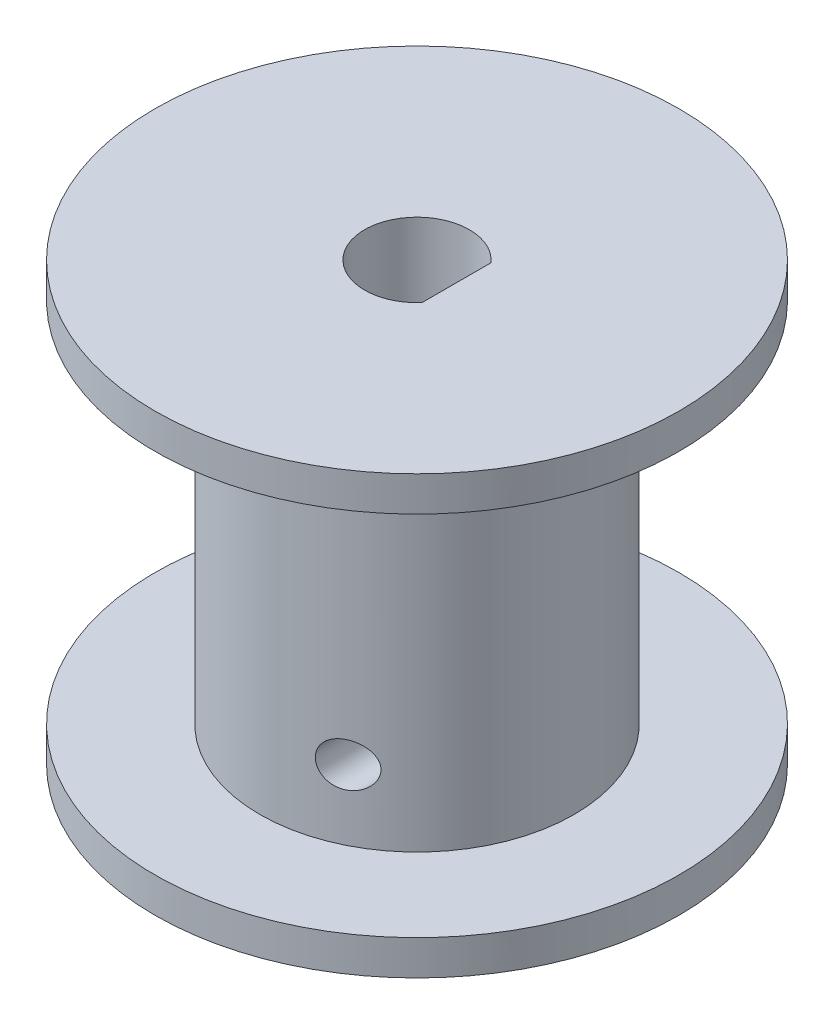
ISO-10303-21;
HEADER;
FILE_DESCRIPTION(('STEP AP214'),'2;1');
FILE_NAME('part.step','',(''),(''),'','','');
FILE_SCHEMA(('AUTOMOTIVE_DESIGN { 1 0 10303 214 1 1 1 1 }'));
ENDSEC;
DATA;
#1=APPLICATION_CONTEXT('core data for automotive mechanical design processes');
#2=APPLICATION_PROTOCOL_DEFINITION('international standard','automotive_design',2000,#1);
#3=PRODUCT_CONTEXT('',#1,'mechanical');
#4=PRODUCT('Part','Part','',(#3));
#5=PRODUCT_RELATED_PRODUCT_CATEGORY('part','',(#4));
#6=PRODUCT_DEFINITION_FORMATION('','',#4);
#7=PRODUCT_DEFINITION_CONTEXT('part definition',#1,'design');
#8=PRODUCT_DEFINITION('design','',#6,#7);
#9=PRODUCT_DEFINITION_SHAPE('','',#8);
#10=(LENGTH_UNIT() NAMED_UNIT(*) SI_UNIT(.MILLI.,.METRE.));
#11=(NAMED_UNIT(*) PLANE_ANGLE_UNIT() SI_UNIT($,.RADIAN.));
#12=(NAMED_UNIT(*) SI_UNIT($,.STERADIAN.) SOLID_ANGLE_UNIT());
#13=UNCERTAINTY_MEASURE_WITH_UNIT(LENGTH_MEASURE(1.E-05),#10,'distance_accuracy_value','');
#14=(GEOMETRIC_REPRESENTATION_CONTEXT(3) GLOBAL_UNCERTAINTY_ASSIGNED_CONTEXT((#13)) GLOBAL_UNIT_ASSIGNED_CONTEXT((#10,
#11,#12)) REPRESENTATION_CONTEXT('',''));
#15=CARTESIAN_POINT('',(0.,0.,0.));
#16=DIRECTION('',(0.,0.,1.));
#17=DIRECTION('',(1.,0.,0.));
#18=AXIS2_PLACEMENT_3D('',#15,#16,#17);
#19=CARTESIAN_POINT('',(0.,25.,0.));
#20=DIRECTION('',(0.,-1.,0.));
#21=DIRECTION('',(0.,0.,-1.));
#22=AXIS2_PLACEMENT_3D('',#19,#20,#21);
#23=CYLINDRICAL_SURFACE('',#22,15.);
#24=CARTESIAN_POINT('',(0.,23.,0.));
#25=DIRECTION('',(0.,-1.,0.));
#26=DIRECTION('',(0.,0.,-1.));
#27=AXIS2_PLACEMENT_3D('',#24,#25,#26);
#28=CIRCLE('',#27,15.);
#29=CARTESIAN_POINT('',(0.,23.,-15.));
#30=VERTEX_POINT('',#29);
#31=EDGE_CURVE('E90',#30,#30,#28,.T.);
#32=ORIENTED_EDGE('',*,*,#31,.F.);
#33=EDGE_LOOP('',(#32));
#34=FACE_BOUND('',#33,.T.);
#35=CARTESIAN_POINT('',(0.,25.,0.));
#36=DIRECTION('',(0.,1.,0.));
#37=DIRECTION('',(0.,0.,1.));
#38=AXIS2_PLACEMENT_3D('',#35,#36,#37);
#39=CIRCLE('',#38,15.);
#40=CARTESIAN_POINT('',(0.,25.,15.));
#41=VERTEX_POINT('',#40);
#42=EDGE_CURVE('E11',#41,#41,#39,.T.);
#43=ORIENTED_EDGE('',*,*,#42,.F.);
#44=EDGE_LOOP('',(#43));
#45=FACE_BOUND('',#44,.T.);
#46=ADVANCED_FACE('F33',(#34,#45),#23,.T.);
#47=CARTESIAN_POINT('',(0.,2.,0.));
#48=DIRECTION('',(0.,-1.,0.));
#49=DIRECTION('',(0.,0.,-1.));
#50=AXIS2_PLACEMENT_3D('',#47,#48,#49);
#51=CIRCLE('',#50,15.);
#52=CARTESIAN_POINT('',(0.,2.,-15.));
#53=VERTEX_POINT('',#52);
#54=EDGE_CURVE('E185',#53,#53,#51,.T.);
#55=ORIENTED_EDGE('',*,*,#54,.T.);
#56=EDGE_LOOP('',(#55));
#57=FACE_BOUND('',#56,.T.);
#58=CARTESIAN_POINT('',(0.,0.,0.));
#59=DIRECTION('',(0.,1.,0.));
#60=DIRECTION('',(0.,0.,1.));
#61=AXIS2_PLACEMENT_3D('',#58,#59,#60);
#62=CIRCLE('',#61,15.);
#63=CARTESIAN_POINT('',(0.,0.,15.));
#64=VERTEX_POINT('',#63);
#65=EDGE_CURVE('E46',#64,#64,#62,.T.);
#66=ORIENTED_EDGE('',*,*,#65,.T.);
#67=EDGE_LOOP('',(#66));
#68=FACE_BOUND('',#67,.T.);
#69=ADVANCED_FACE('F35',(#57,#68),#23,.T.);
#70=CARTESIAN_POINT('',(0.,0.,0.));
#71=DIRECTION('',(0.,1.,0.));
#72=DIRECTION('',(0.,0.,1.));
#73=AXIS2_PLACEMENT_3D('',#70,#71,#72);
#74=CYLINDRICAL_SURFACE('',#73,3.);
#75=DIRECTION('',(0.,-1.,0.));
#76=VECTOR('',#75,1.);
#77=CARTESIAN_POINT('',(2.26,25.,-1.97291662266807));
#78=LINE('',#77,#76);
#79=CARTESIAN_POINT('',(2.26,25.,-1.97291662266807));
#80=VERTEX_POINT('',#79);
#81=CARTESIAN_POINT('',(2.26,0.,-1.97291662266807));
#82=VERTEX_POINT('',#81);
#83=EDGE_CURVE('E54',#80,#82,#78,.T.);
#84=ORIENTED_EDGE('',*,*,#83,.F.);
#85=CARTESIAN_POINT('',(0.,25.,0.));
#86=DIRECTION('',(0.,1.,0.));
#87=DIRECTION('',(0.,0.,1.));
#88=AXIS2_PLACEMENT_3D('',#85,#86,#87);
#89=CIRCLE('',#88,3.);
#90=CARTESIAN_POINT('',(2.26,25.,1.97291662266807));
#91=VERTEX_POINT('',#90);
#92=EDGE_CURVE('E77',#80,#91,#89,.T.);
#93=ORIENTED_EDGE('',*,*,#92,.T.);
#94=DIRECTION('',(0.,-1.,0.));
#95=VECTOR('',#94,1.);
#96=CARTESIAN_POINT('',(2.26,25.,1.97291662266807));
#97=LINE('',#96,#95);
#98=CARTESIAN_POINT('',(2.26,0.,1.97291662266807));
#99=VERTEX_POINT('',#98);
#100=EDGE_CURVE('E68',#91,#99,#97,.T.);
#101=ORIENTED_EDGE('',*,*,#100,.T.);
#102=CARTESIAN_POINT('',(0.,0.,0.));
#103=DIRECTION('',(0.,1.,0.));
#104=DIRECTION('',(0.,0.,1.));
#105=AXIS2_PLACEMENT_3D('',#102,#103,#104);
#106=CIRCLE('',#105,3.);
#107=EDGE_CURVE('E76',#82,#99,#106,.T.);
#108=ORIENTED_EDGE('',*,*,#107,.F.);
#109=EDGE_LOOP('',(#84,#93,#101,#108));
#110=FACE_BOUND('',#109,.T.);
#111=ADVANCED_FACE('F75',(#110),#74,.F.);
#112=CARTESIAN_POINT('',(0.,25.,0.));
#113=DIRECTION('',(0.,1.,0.));
#114=DIRECTION('',(0.,0.,1.));
#115=AXIS2_PLACEMENT_3D('',#112,#113,#114);
#116=PLANE('',#115);
#117=DIRECTION('',(0.,0.,1.));
#118=VECTOR('',#117,1.);
#119=CARTESIAN_POINT('',(2.26,25.,-1.97291662266807));
#120=LINE('',#119,#118);
#121=EDGE_CURVE('E61',#80,#91,#120,.T.);
#122=ORIENTED_EDGE('',*,*,#121,.T.);
#123=ORIENTED_EDGE('',*,*,#92,.F.);
#124=EDGE_LOOP('',(#122,#123));
#125=FACE_BOUND('',#124,.T.);
#126=ORIENTED_EDGE('',*,*,#42,.T.);
#127=EDGE_LOOP('',(#126));
#128=FACE_BOUND('',#127,.T.);
#129=ADVANCED_FACE('F121',(#125,#128),#116,.T.);
#130=CARTESIAN_POINT('',(0.,0.,0.));
#131=DIRECTION('',(0.,1.,0.));
#132=DIRECTION('',(0.,0.,1.));
#133=AXIS2_PLACEMENT_3D('',#130,#131,#132);
#134=PLANE('',#133);
#135=ORIENTED_EDGE('',*,*,#107,.T.);
#136=DIRECTION('',(0.,0.,1.));
#137=VECTOR('',#136,1.);
#138=CARTESIAN_POINT('',(2.26,0.,-1.97291662266807));
#139=LINE('',#138,#137);
#140=EDGE_CURVE('E65',#82,#99,#139,.T.);
#141=ORIENTED_EDGE('',*,*,#140,.F.);
#142=EDGE_LOOP('',(#135,#141));
#143=FACE_BOUND('',#142,.T.);
#144=ORIENTED_EDGE('',*,*,#65,.F.);
#145=EDGE_LOOP('',(#144));
#146=FACE_BOUND('',#145,.T.);
#147=ADVANCED_FACE('F79',(#143,#146),#134,.F.);
#148=CARTESIAN_POINT('',(2.26,25.,-1.97291662266807));
#149=DIRECTION('',(1.,0.,0.));
#150=DIRECTION('',(0.,0.,-1.));
#151=AXIS2_PLACEMENT_3D('',#148,#149,#150);
#152=PLANE('',#151);
#153=ORIENTED_EDGE('',*,*,#140,.T.);
#154=ORIENTED_EDGE('',*,*,#100,.F.);
#155=ORIENTED_EDGE('',*,*,#121,.F.);
#156=ORIENTED_EDGE('',*,*,#83,.T.);
#157=EDGE_LOOP('',(#153,#154,#155,#156));
#158=FACE_BOUND('',#157,.T.);
#159=ADVANCED_FACE('F67',(#158),#152,.F.);
#160=CARTESIAN_POINT('',(15.,23.,0.));
#161=DIRECTION('',(0.,1.,0.));
#162=DIRECTION('',(0.,0.,1.));
#163=AXIS2_PLACEMENT_3D('',#160,#161,#162);
#164=PLANE('',#163);
#165=CARTESIAN_POINT('',(0.,23.,0.));
#166=DIRECTION('',(0.,-1.,0.));
#167=DIRECTION('',(0.,0.,-1.));
#168=AXIS2_PLACEMENT_3D('',#165,#166,#167);
#169=CIRCLE('',#168,9.);
#170=CARTESIAN_POINT('',(0.,23.,-9.));
#171=VERTEX_POINT('',#170);
#172=EDGE_CURVE('E182',#171,#171,#169,.T.);
#173=ORIENTED_EDGE('',*,*,#172,.F.);
#174=EDGE_LOOP('',(#173));
#175=FACE_BOUND('',#174,.T.);
#176=ORIENTED_EDGE('',*,*,#31,.T.);
#177=EDGE_LOOP('',(#176));
#178=FACE_BOUND('',#177,.T.);
#179=ADVANCED_FACE('F100',(#175,#178),#164,.F.);
#180=CARTESIAN_POINT('',(0.,0.,0.));
#181=DIRECTION('',(0.,-1.,0.));
#182=DIRECTION('',(0.,0.,-1.));
#183=AXIS2_PLACEMENT_3D('',#180,#181,#182);
#184=CYLINDRICAL_SURFACE('',#183,9.);
#185=CARTESIAN_POINT('',(2.75,6.,8.56956825050131));
#186=CARTESIAN_POINT('',(2.74999898445752,6.06748109284129,8.56956840033699));
#187=CARTESIAN_POINT('',(2.75548050125752,6.13495503922291,8.56781528844884));
#188=CARTESIAN_POINT('',(2.77720005153497,6.26795282341906,8.56079953902308));
#189=CARTESIAN_POINT('',(2.7934366566861,6.3334769189757,8.55553736750447));
#190=CARTESIAN_POINT('',(2.83605736016252,6.46069018226167,8.54150322785503));
#191=CARTESIAN_POINT('',(2.86243568202035,6.52238150984727,8.53273325756391));
#192=CARTESIAN_POINT('',(2.92438471916907,6.64030334146552,8.51170013441259));
#193=CARTESIAN_POINT('',(2.95995580116299,6.69653362753181,8.49943684220033));
#194=CARTESIAN_POINT('',(3.03957361788372,6.80283899041248,8.47129227907988));
#195=CARTESIAN_POINT('',(3.08372826766199,6.85282074785538,8.45536441069197));
#196=CARTESIAN_POINT('',(3.17867208005764,6.94460726158576,8.42013089724981));
#197=CARTESIAN_POINT('',(3.22946212169081,6.98641093265511,8.40082480455404));
#198=CARTESIAN_POINT('',(3.33837424271175,7.06271456478328,8.35815879003311));
#199=CARTESIAN_POINT('',(3.39671924444672,7.09681738768659,8.33465898835829));
#200=CARTESIAN_POINT('',(3.51702956185443,7.15486161851635,8.28460927007217));
#201=CARTESIAN_POINT('',(3.57899593388826,7.17880004446604,8.2580584612714));
#202=CARTESIAN_POINT('',(3.70938135185286,7.21778407819064,8.20036127438487));
#203=CARTESIAN_POINT('',(3.7779433822067,7.23206344253225,8.16902153870815));
#204=CARTESIAN_POINT('',(3.91539663850579,7.24905720373002,8.10403961560436));
#205=CARTESIAN_POINT('',(3.98428797182717,7.2517675281794,8.0703966216429));
#206=CARTESIAN_POINT('',(4.12696061737114,7.24576354657398,7.9984456638806));
#207=CARTESIAN_POINT('',(4.20062378479926,7.23599871638337,7.95999040237604));
#208=CARTESIAN_POINT('',(4.34471761397451,7.20379692394593,7.88226765617835));
#209=CARTESIAN_POINT('',(4.41514604083585,7.18135133883282,7.84299963633498));
#210=CARTESIAN_POINT('',(4.55589823095561,7.1223629280472,7.76214033817617));
#211=CARTESIAN_POINT('',(4.62587535644176,7.08494967601686,7.72057700701714));
#212=CARTESIAN_POINT('',(4.75836402632192,6.99684794581737,7.63963299197922));
#213=CARTESIAN_POINT('',(4.82087908205255,6.94616574759618,7.6002512862316));
#214=CARTESIAN_POINT('',(4.92581659450974,6.84248399469891,7.53256310013026));
#215=CARTESIAN_POINT('',(4.96982851578777,6.79155805210939,7.50354123206859));
#216=CARTESIAN_POINT('',(5.04990330182067,6.6817658821725,7.4498856095966));
#217=CARTESIAN_POINT('',(5.08597615317333,6.62290978229199,7.42524634985465));
#218=CARTESIAN_POINT('',(5.1437638381857,6.50774119024988,7.38530565230457));
#219=CARTESIAN_POINT('',(5.16682792023432,6.45240304463393,7.36915399114304));
#220=CARTESIAN_POINT('',(5.20500432817279,6.33779426816302,7.34223941027348));
#221=CARTESIAN_POINT('',(5.2201211540922,6.2785258842122,7.33147344115565));
#222=CARTESIAN_POINT('',(5.24158951672312,6.15734178607914,7.31614103671992));
#223=CARTESIAN_POINT('',(5.24790208051023,6.09541554409707,7.31160216770412));
#224=CARTESIAN_POINT('',(5.25121055826339,5.97118790672956,7.30922659805766));
#225=CARTESIAN_POINT('',(5.24820822153693,5.90888658397615,7.3113886390182));
#226=CARTESIAN_POINT('',(5.23367517937532,5.79065421516753,7.3217969995151));
#227=CARTESIAN_POINT('',(5.22280523699127,5.73459726425811,7.32957180518487));
#228=CARTESIAN_POINT('',(5.19387082176528,5.62534271684742,7.35010325559507));
#229=CARTESIAN_POINT('',(5.17580503635215,5.5721456440179,7.36286080921468));
#230=CARTESIAN_POINT('',(5.13212985305557,5.4668935663181,7.39337447696311));
#231=CARTESIAN_POINT('',(5.10616676881979,5.41505414028762,7.41136267206455));
#232=CARTESIAN_POINT('',(5.04812689845559,5.31647481192927,7.45101668382297));
#233=CARTESIAN_POINT('',(5.016047330821,5.26973724496636,7.47268417316793));
#234=CARTESIAN_POINT('',(4.94125959860237,5.17494088674768,7.52238432920537));
#235=CARTESIAN_POINT('',(4.89767377539566,5.12781967011857,7.55088247190672));
#236=CARTESIAN_POINT('',(4.80477884821356,5.04142773292884,7.61033163165459));
#237=CARTESIAN_POINT('',(4.75546609589099,5.00216206059315,7.64128420827496));
#238=CARTESIAN_POINT('',(4.64348106127928,4.92586881144645,7.70993372782507));
#239=CARTESIAN_POINT('',(4.57995552234076,4.89032229346443,7.7478908701455));
#240=CARTESIAN_POINT('',(4.44800460110932,4.83079684311652,7.82439014515862));
#241=CARTESIAN_POINT('',(4.37957648303257,4.80682442809595,7.86293259486727));
#242=CARTESIAN_POINT('',(4.23287586989851,4.76934698558713,7.94294336980357));
#243=CARTESIAN_POINT('',(4.15427478544352,4.75699637236922,7.98435784987994));
#244=CARTESIAN_POINT('',(3.9951101198024,4.74747078848273,8.06517565318835));
#245=CARTESIAN_POINT('',(3.91454652620908,4.75029591378153,8.10457896370068));
#246=CARTESIAN_POINT('',(3.75570037106434,4.77154630622431,8.17937989622747));
#247=CARTESIAN_POINT('',(3.67740582731558,4.78963728854872,8.21484506902712));
#248=CARTESIAN_POINT('',(3.52423270920601,4.84126605038472,8.2817122203257));
#249=CARTESIAN_POINT('',(3.44935205378852,4.87479427737811,8.31311669620072));
#250=CARTESIAN_POINT('',(3.31263806799777,4.95325153783725,8.36847595830984));
#251=CARTESIAN_POINT('',(3.25023670512207,4.99689738307303,8.3928453257872));
#252=CARTESIAN_POINT('',(3.13355428542456,5.09578291377802,8.43710454346615));
#253=CARTESIAN_POINT('',(3.07926837838098,5.151015626503,8.45699707288317));
#254=CARTESIAN_POINT('',(2.98557987455822,5.26619161454378,8.49049932175939));
#255=CARTESIAN_POINT('',(2.94529049860919,5.32529953030637,8.504506545284));
#256=CARTESIAN_POINT('',(2.87514486838216,5.45016055090765,8.52847710839149));
#257=CARTESIAN_POINT('',(2.84528616174551,5.5159120890685,8.53844139859905));
#258=CARTESIAN_POINT('',(2.79783097931602,5.6503576537305,8.55410753565539));
#259=CARTESIAN_POINT('',(2.77995453658558,5.71894156438156,8.55990694536052));
#260=CARTESIAN_POINT('',(2.75604053831161,5.85835318384165,8.56763691093104));
#261=CARTESIAN_POINT('',(2.75000106578272,5.92918052744073,8.56956809325305));
#262=CARTESIAN_POINT('',(2.75,6.,8.56956825050131));
#263=B_SPLINE_CURVE_WITH_KNOTS('',3,(#185,#186,#187,#188,#189,#190,#191,#192,#193,#194,#195,
#196,#197,#198,#199,#200,#201,#202,#203,#204,#205,#206,#207,#208,#209,#210,#211,#212,#213,#214,
#215,#216,#217,#218,#219,#220,#221,#222,#223,#224,#225,#226,#227,#228,#229,#230,#231,#232,#233,
#234,#235,#236,#237,#238,#239,#240,#241,#242,#243,#244,#245,#246,#247,#248,#249,#250,#251,#252,
#253,#254,#255,#256,#257,#258,#259,#260,#261,#262),.UNSPECIFIED.,.T.,.F.,(4,2,2,2,2,2,2,2,2,2,2,
2,2,2,2,2,2,2,2,2,2,2,2,2,2,2,2,2,2,2,2,2,2,2,2,2,2,2,4),(0.,0.202188457607005,
0.404350069018069,0.606396704422043,0.808451400794793,1.01323320561863,1.21804216623367,
1.43176637700076,1.64555324579087,1.87476504828599,2.10405752876047,2.3539931416769,
2.60409891479955,2.87156621654073,3.1389071590536,3.35794003630555,3.57669579587981,
3.76218410085205,3.94756726207105,4.1337684631296,4.31993469833583,4.4920504165694,
4.66419754427975,4.84561019447207,5.02710554073529,5.2369999718395,5.44702885760408,
5.69229935255777,5.9377077980343,6.20550409839442,6.4733020922299,6.73538372258006,
6.99730339515427,7.2358679060608,7.4742892633566,7.69184361332721,7.9093467795318,
8.12157214248596,8.3337631329161),.UNSPECIFIED.);
#264=CARTESIAN_POINT('',(2.75,6.,8.56956825050131));
#265=VERTEX_POINT('',#264);
#266=EDGE_CURVE('E37',#265,#265,#263,.T.);
#267=ORIENTED_EDGE('',*,*,#266,.T.);
#268=EDGE_LOOP('',(#267));
#269=FACE_BOUND('',#268,.T.);
#270=CARTESIAN_POINT('',(2.75,6.,-8.56956825050131));
#271=CARTESIAN_POINT('',(2.74999898445752,5.93251890715871,-8.56956840033699));
#272=CARTESIAN_POINT('',(2.75548050125752,5.86504496077709,-8.56781528844884));
#273=CARTESIAN_POINT('',(2.77720005153497,5.73204717658094,-8.56079953902308));
#274=CARTESIAN_POINT('',(2.7934366566861,5.6665230810243,-8.55553736750447));
#275=CARTESIAN_POINT('',(2.83605736016252,5.53930981773833,-8.54150322785503));
#276=CARTESIAN_POINT('',(2.86243568202035,5.47761849015273,-8.53273325756391));
#277=CARTESIAN_POINT('',(2.92438471916907,5.35969665853448,-8.51170013441259));
#278=CARTESIAN_POINT('',(2.95995580116299,5.30346637246819,-8.49943684220033));
#279=CARTESIAN_POINT('',(3.03957361788372,5.19716100958752,-8.47129227907988));
#280=CARTESIAN_POINT('',(3.08372826766199,5.14717925214462,-8.45536441069197));
#281=CARTESIAN_POINT('',(3.17867208005764,5.05539273841424,-8.42013089724981));
#282=CARTESIAN_POINT('',(3.22946212169081,5.01358906734489,-8.40082480455404));
#283=CARTESIAN_POINT('',(3.33837424271175,4.93728543521672,-8.35815879003311));
#284=CARTESIAN_POINT('',(3.39671924444672,4.90318261231341,-8.33465898835829));
#285=CARTESIAN_POINT('',(3.51702956185443,4.84513838148365,-8.28460927007217));
#286=CARTESIAN_POINT('',(3.57899593388826,4.82119995553396,-8.2580584612714));
#287=CARTESIAN_POINT('',(3.70938135185286,4.78221592180936,-8.20036127438487));
#288=CARTESIAN_POINT('',(3.7779433822067,4.76793655746775,-8.16902153870815));
#289=CARTESIAN_POINT('',(3.91539663850579,4.75094279626998,-8.10403961560436));
#290=CARTESIAN_POINT('',(3.98428797182717,4.7482324718206,-8.0703966216429));
#291=CARTESIAN_POINT('',(4.12696061737114,4.75423645342602,-7.9984456638806));
#292=CARTESIAN_POINT('',(4.20062378479926,4.76400128361663,-7.95999040237604));
#293=CARTESIAN_POINT('',(4.34471761397451,4.79620307605407,-7.88226765617835));
#294=CARTESIAN_POINT('',(4.41514604083585,4.81864866116718,-7.84299963633498));
#295=CARTESIAN_POINT('',(4.55589823095561,4.8776370719528,-7.76214033817617));
#296=CARTESIAN_POINT('',(4.62587535644176,4.91505032398314,-7.72057700701714));
#297=CARTESIAN_POINT('',(4.75836402632192,5.00315205418264,-7.63963299197922));
#298=CARTESIAN_POINT('',(4.82087908205255,5.05383425240382,-7.6002512862316));
#299=CARTESIAN_POINT('',(4.92581659450974,5.15751600530109,-7.53256310013026));
#300=CARTESIAN_POINT('',(4.96982851578777,5.20844194789061,-7.50354123206859));
#301=CARTESIAN_POINT('',(5.04990330182067,5.3182341178275,-7.4498856095966));
#302=CARTESIAN_POINT('',(5.08597615317333,5.37709021770801,-7.42524634985465));
#303=CARTESIAN_POINT('',(5.1437638381857,5.49225880975012,-7.38530565230457));
#304=CARTESIAN_POINT('',(5.16682792023432,5.54759695536607,-7.36915399114304));
#305=CARTESIAN_POINT('',(5.20500432817279,5.66220573183698,-7.34223941027348));
#306=CARTESIAN_POINT('',(5.2201211540922,5.7214741157878,-7.33147344115565));
#307=CARTESIAN_POINT('',(5.24158951672312,5.84265821392086,-7.31614103671992));
#308=CARTESIAN_POINT('',(5.24790208051023,5.90458445590293,-7.31160216770412));
#309=CARTESIAN_POINT('',(5.25121055826339,6.02881209327043,-7.30922659805766));
#310=CARTESIAN_POINT('',(5.24820822153693,6.09111341602385,-7.3113886390182));
#311=CARTESIAN_POINT('',(5.23367517937532,6.20934578483247,-7.3217969995151));
#312=CARTESIAN_POINT('',(5.22280523699127,6.26540273574189,-7.32957180518487));
#313=CARTESIAN_POINT('',(5.19387082176528,6.37465728315258,-7.35010325559507));
#314=CARTESIAN_POINT('',(5.17580503635215,6.4278543559821,-7.36286080921468));
#315=CARTESIAN_POINT('',(5.13212985305557,6.5331064336819,-7.39337447696311));
#316=CARTESIAN_POINT('',(5.10616676881979,6.58494585971238,-7.41136267206455));
#317=CARTESIAN_POINT('',(5.04812689845559,6.68352518807073,-7.45101668382297));
#318=CARTESIAN_POINT('',(5.016047330821,6.73026275503364,-7.47268417316793));
#319=CARTESIAN_POINT('',(4.94125959860237,6.82505911325232,-7.52238432920537));
#320=CARTESIAN_POINT('',(4.89767377539566,6.87218032988143,-7.55088247190672));
#321=CARTESIAN_POINT('',(4.80477884821356,6.95857226707116,-7.61033163165459));
#322=CARTESIAN_POINT('',(4.75546609589099,6.99783793940685,-7.64128420827496));
#323=CARTESIAN_POINT('',(4.64348106127928,7.07413118855355,-7.70993372782507));
#324=CARTESIAN_POINT('',(4.57995552234076,7.10967770653557,-7.7478908701455));
#325=CARTESIAN_POINT('',(4.44800460110932,7.16920315688348,-7.82439014515862));
#326=CARTESIAN_POINT('',(4.37957648303257,7.19317557190405,-7.86293259486727));
#327=CARTESIAN_POINT('',(4.23287586989851,7.23065301441287,-7.94294336980357));
#328=CARTESIAN_POINT('',(4.15427478544352,7.24300362763078,-7.98435784987994));
#329=CARTESIAN_POINT('',(3.9951101198024,7.25252921151727,-8.06517565318835));
#330=CARTESIAN_POINT('',(3.91454652620908,7.24970408621848,-8.10457896370068));
#331=CARTESIAN_POINT('',(3.75570037106434,7.22845369377569,-8.17937989622747));
#332=CARTESIAN_POINT('',(3.67740582731558,7.21036271145128,-8.21484506902712));
#333=CARTESIAN_POINT('',(3.52423270920601,7.15873394961528,-8.2817122203257));
#334=CARTESIAN_POINT('',(3.44935205378852,7.12520572262189,-8.31311669620072));
#335=CARTESIAN_POINT('',(3.31263806799777,7.04674846216275,-8.36847595830984));
#336=CARTESIAN_POINT('',(3.25023670512207,7.00310261692697,-8.3928453257872));
#337=CARTESIAN_POINT('',(3.13355428542456,6.90421708622198,-8.43710454346615));
#338=CARTESIAN_POINT('',(3.07926837838098,6.848984373497,-8.45699707288317));
#339=CARTESIAN_POINT('',(2.98557987455822,6.73380838545622,-8.49049932175939));
#340=CARTESIAN_POINT('',(2.94529049860919,6.67470046969363,-8.504506545284));
#341=CARTESIAN_POINT('',(2.87514486838216,6.54983944909235,-8.52847710839149));
#342=CARTESIAN_POINT('',(2.84528616174551,6.4840879109315,-8.53844139859905));
#343=CARTESIAN_POINT('',(2.79783097931602,6.3496423462695,-8.55410753565539));
#344=CARTESIAN_POINT('',(2.77995453658558,6.28105843561844,-8.55990694536052));
#345=CARTESIAN_POINT('',(2.75604053831161,6.14164681615835,-8.56763691093104));
#346=CARTESIAN_POINT('',(2.75000106578272,6.07081947255927,-8.56956809325305));
#347=CARTESIAN_POINT('',(2.75,6.,-8.56956825050131));
#348=B_SPLINE_CURVE_WITH_KNOTS('',3,(#270,#271,#272,#273,#274,#275,#276,#277,#278,#279,#280,
#281,#282,#283,#284,#285,#286,#287,#288,#289,#290,#291,#292,#293,#294,#295,#296,#297,#298,#299,
#300,#301,#302,#303,#304,#305,#306,#307,#308,#309,#310,#311,#312,#313,#314,#315,#316,#317,#318,
#319,#320,#321,#322,#323,#324,#325,#326,#327,#328,#329,#330,#331,#332,#333,#334,#335,#336,#337,
#338,#339,#340,#341,#342,#343,#344,#345,#346,#347),.UNSPECIFIED.,.T.,.F.,(4,2,2,2,2,2,2,2,2,2,2,
2,2,2,2,2,2,2,2,2,2,2,2,2,2,2,2,2,2,2,2,2,2,2,2,2,2,2,4),(0.,0.202188457607005,
0.404350069018069,0.606396704422043,0.808451400794793,1.01323320561863,1.21804216623367,
1.43176637700076,1.64555324579087,1.87476504828599,2.10405752876047,2.3539931416769,
2.60409891479955,2.87156621654073,3.1389071590536,3.35794003630555,3.57669579587981,
3.76218410085205,3.94756726207105,4.13376846312959,4.31993469833583,4.4920504165694,
4.66419754427975,4.84561019447207,5.02710554073529,5.2369999718395,5.44702885760408,
5.69229935255777,5.9377077980343,6.20550409839442,6.4733020922299,6.73538372258006,
6.99730339515427,7.2358679060608,7.4742892633566,7.69184361332721,7.9093467795318,
8.12157214248596,8.3337631329161),.UNSPECIFIED.);
#349=CARTESIAN_POINT('',(2.75,6.,-8.56956825050131));
#350=VERTEX_POINT('',#349);
#351=EDGE_CURVE('E86',#350,#350,#348,.T.);
#352=ORIENTED_EDGE('',*,*,#351,.T.);
#353=EDGE_LOOP('',(#352));
#354=FACE_BOUND('',#353,.T.);
#355=CARTESIAN_POINT('',(0.,2.,0.));
#356=DIRECTION('',(0.,-1.,0.));
#357=DIRECTION('',(0.,0.,-1.));
#358=AXIS2_PLACEMENT_3D('',#355,#356,#357);
#359=CIRCLE('',#358,9.);
#360=CARTESIAN_POINT('',(0.,2.,-9.));
#361=VERTEX_POINT('',#360);
#362=EDGE_CURVE('E180',#361,#361,#359,.T.);
#363=ORIENTED_EDGE('',*,*,#362,.F.);
#364=EDGE_LOOP('',(#363));
#365=FACE_BOUND('',#364,.T.);
#366=ORIENTED_EDGE('',*,*,#172,.T.);
#367=EDGE_LOOP('',(#366));
#368=FACE_BOUND('',#367,.T.);
#369=ADVANCED_FACE('F95',(#269,#354,#365,#368),#184,.T.);
#370=CARTESIAN_POINT('',(15.,2.,0.));
#371=DIRECTION('',(0.,-1.,0.));
#372=DIRECTION('',(0.,0.,-1.));
#373=AXIS2_PLACEMENT_3D('',#370,#371,#372);
#374=PLANE('',#373);
#375=ORIENTED_EDGE('',*,*,#54,.F.);
#376=EDGE_LOOP('',(#375));
#377=FACE_BOUND('',#376,.T.);
#378=ORIENTED_EDGE('',*,*,#362,.T.);
#379=EDGE_LOOP('',(#378));
#380=FACE_BOUND('',#379,.T.);
#381=ADVANCED_FACE('F99',(#377,#380),#374,.F.);
#382=CARTESIAN_POINT('',(4.,6.,2000.));
#383=DIRECTION('',(0.,0.,-1.));
#384=DIRECTION('',(-1.,0.,0.));
#385=AXIS2_PLACEMENT_3D('',#382,#383,#384);
#386=CYLINDRICAL_SURFACE('',#385,1.25);
#387=ORIENTED_EDGE('',*,*,#266,.F.);
#388=EDGE_LOOP('',(#387));
#389=FACE_BOUND('',#388,.T.);
#390=ORIENTED_EDGE('',*,*,#351,.F.);
#391=EDGE_LOOP('',(#390));
#392=FACE_BOUND('',#391,.T.);
#393=ADVANCED_FACE('F91',(#389,#392),#386,.F.);
#394=CLOSED_SHELL('',(#46,#69,#111,#129,#147,#159,#179,#369,#381,#393));
#395=MANIFOLD_SOLID_BREP('B2',#394);
#396=ADVANCED_BREP_SHAPE_REPRESENTATION('',(#18,#395),#14);
#397=SHAPE_DEFINITION_REPRESENTATION(#9,#396);
ENDSEC;
END-ISO-10303-21;
